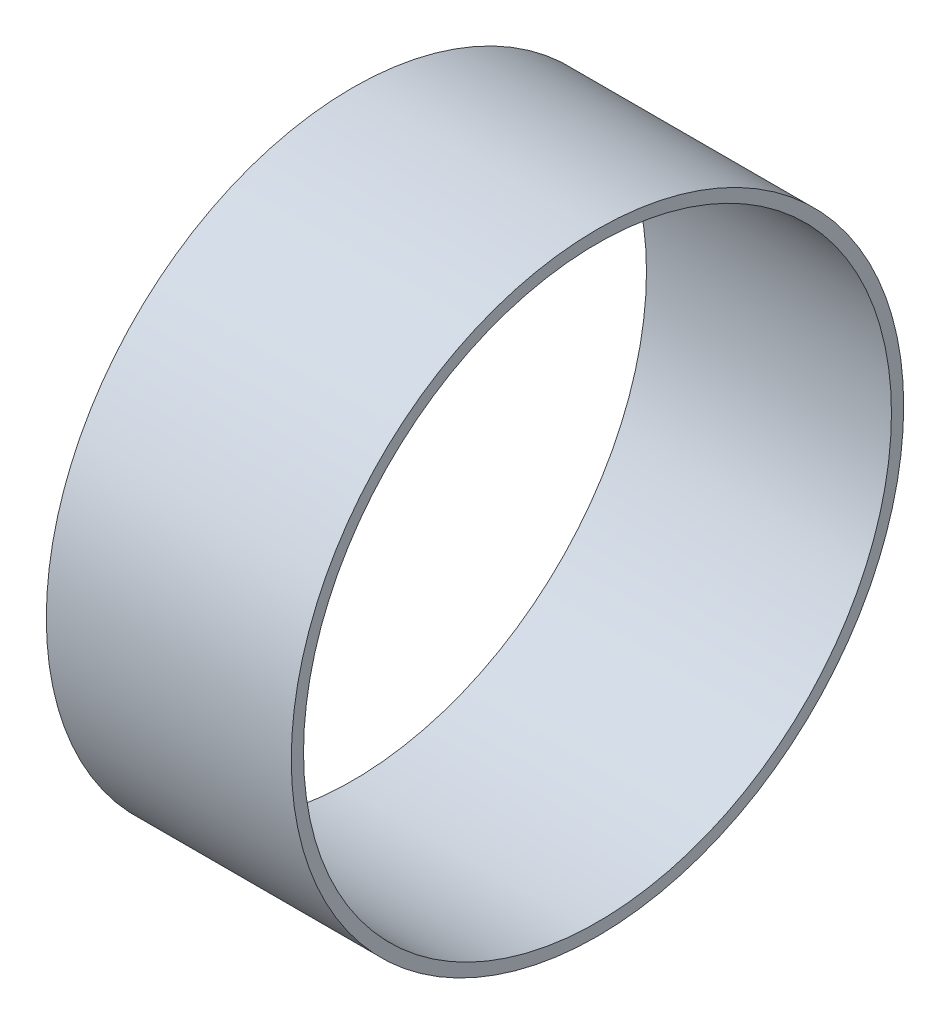
ISO-10303-21;
HEADER;
FILE_DESCRIPTION(('STEP AP214'),'2;1');
FILE_NAME('part.step','',(''),(''),'','','');
FILE_SCHEMA(('AUTOMOTIVE_DESIGN { 1 0 10303 214 1 1 1 1 }'));
ENDSEC;
DATA;
#1=APPLICATION_CONTEXT('core data for automotive mechanical design processes');
#2=APPLICATION_PROTOCOL_DEFINITION('international standard','automotive_design',2000,#1);
#3=PRODUCT_CONTEXT('',#1,'mechanical');
#4=PRODUCT('Part','Part','',(#3));
#5=PRODUCT_RELATED_PRODUCT_CATEGORY('part','',(#4));
#6=PRODUCT_DEFINITION_FORMATION('','',#4);
#7=PRODUCT_DEFINITION_CONTEXT('part definition',#1,'design');
#8=PRODUCT_DEFINITION('design','',#6,#7);
#9=PRODUCT_DEFINITION_SHAPE('','',#8);
#10=(LENGTH_UNIT() NAMED_UNIT(*) SI_UNIT(.MILLI.,.METRE.));
#11=(NAMED_UNIT(*) PLANE_ANGLE_UNIT() SI_UNIT($,.RADIAN.));
#12=(NAMED_UNIT(*) SI_UNIT($,.STERADIAN.) SOLID_ANGLE_UNIT());
#13=UNCERTAINTY_MEASURE_WITH_UNIT(LENGTH_MEASURE(1.E-05),#10,'distance_accuracy_value','');
#14=(GEOMETRIC_REPRESENTATION_CONTEXT(3) GLOBAL_UNCERTAINTY_ASSIGNED_CONTEXT((#13)) GLOBAL_UNIT_ASSIGNED_CONTEXT((#10,
#11,#12)) REPRESENTATION_CONTEXT('',''));
#15=CARTESIAN_POINT('',(0.,0.,0.));
#16=DIRECTION('',(0.,0.,1.));
#17=DIRECTION('',(1.,0.,0.));
#18=AXIS2_PLACEMENT_3D('',#15,#16,#17);
#19=CARTESIAN_POINT('',(10.,0.,0.));
#20=DIRECTION('',(1.,0.,0.));
#21=DIRECTION('',(0.,0.,-1.));
#22=AXIS2_PLACEMENT_3D('',#19,#20,#21);
#23=PLANE('',#22);
#24=CARTESIAN_POINT('',(10.,0.,0.));
#25=DIRECTION('',(1.,0.,0.));
#26=DIRECTION('',(0.,0.,-1.));
#27=AXIS2_PLACEMENT_3D('',#24,#25,#26);
#28=CIRCLE('',#27,12.5);
#29=CARTESIAN_POINT('',(10.,0.,-12.5));
#30=VERTEX_POINT('',#29);
#31=EDGE_CURVE('E10',#30,#30,#28,.T.);
#32=ORIENTED_EDGE('',*,*,#31,.T.);
#33=EDGE_LOOP('',(#32));
#34=FACE_BOUND('',#33,.T.);
#35=CARTESIAN_POINT('',(10.,0.,0.));
#36=DIRECTION('',(1.,0.,0.));
#37=DIRECTION('',(0.,0.,-1.));
#38=AXIS2_PLACEMENT_3D('',#35,#36,#37);
#39=CIRCLE('',#38,12.);
#40=CARTESIAN_POINT('',(10.,0.,-12.));
#41=VERTEX_POINT('',#40);
#42=EDGE_CURVE('E50',#41,#41,#39,.T.);
#43=ORIENTED_EDGE('',*,*,#42,.F.);
#44=EDGE_LOOP('',(#43));
#45=FACE_BOUND('',#44,.T.);
#46=ADVANCED_FACE('F37',(#34,#45),#23,.T.);
#47=CARTESIAN_POINT('',(0.,0.,0.));
#48=DIRECTION('',(1.,0.,0.));
#49=DIRECTION('',(0.,0.,-1.));
#50=AXIS2_PLACEMENT_3D('',#47,#48,#49);
#51=PLANE('',#50);
#52=CARTESIAN_POINT('',(0.,0.,0.));
#53=DIRECTION('',(1.,0.,0.));
#54=DIRECTION('',(0.,0.,-1.));
#55=AXIS2_PLACEMENT_3D('',#52,#53,#54);
#56=CIRCLE('',#55,12.5);
#57=CARTESIAN_POINT('',(0.,0.,-12.5));
#58=VERTEX_POINT('',#57);
#59=EDGE_CURVE('E41',#58,#58,#56,.T.);
#60=ORIENTED_EDGE('',*,*,#59,.F.);
#61=EDGE_LOOP('',(#60));
#62=FACE_BOUND('',#61,.T.);
#63=CARTESIAN_POINT('',(0.,0.,0.));
#64=DIRECTION('',(1.,0.,0.));
#65=DIRECTION('',(0.,0.,-1.));
#66=AXIS2_PLACEMENT_3D('',#63,#64,#65);
#67=CIRCLE('',#66,12.);
#68=CARTESIAN_POINT('',(0.,0.,-12.));
#69=VERTEX_POINT('',#68);
#70=EDGE_CURVE('E52',#69,#69,#67,.T.);
#71=ORIENTED_EDGE('',*,*,#70,.T.);
#72=EDGE_LOOP('',(#71));
#73=FACE_BOUND('',#72,.T.);
#74=ADVANCED_FACE('F64',(#62,#73),#51,.F.);
#75=CARTESIAN_POINT('',(10.,0.,0.));
#76=DIRECTION('',(-1.,0.,0.));
#77=DIRECTION('',(0.,0.,1.));
#78=AXIS2_PLACEMENT_3D('',#75,#76,#77);
#79=CYLINDRICAL_SURFACE('',#78,12.5);
#80=ORIENTED_EDGE('',*,*,#31,.F.);
#81=EDGE_LOOP('',(#80));
#82=FACE_BOUND('',#81,.T.);
#83=ORIENTED_EDGE('',*,*,#59,.T.);
#84=EDGE_LOOP('',(#83));
#85=FACE_BOUND('',#84,.T.);
#86=ADVANCED_FACE('F39',(#82,#85),#79,.T.);
#87=CARTESIAN_POINT('',(10.,0.,0.));
#88=DIRECTION('',(-1.,0.,0.));
#89=DIRECTION('',(0.,0.,1.));
#90=AXIS2_PLACEMENT_3D('',#87,#88,#89);
#91=CYLINDRICAL_SURFACE('',#90,12.);
#92=ORIENTED_EDGE('',*,*,#42,.T.);
#93=EDGE_LOOP('',(#92));
#94=FACE_BOUND('',#93,.T.);
#95=ORIENTED_EDGE('',*,*,#70,.F.);
#96=EDGE_LOOP('',(#95));
#97=FACE_BOUND('',#96,.T.);
#98=ADVANCED_FACE('F60',(#94,#97),#91,.F.);
#99=CLOSED_SHELL('',(#46,#74,#86,#98));
#100=MANIFOLD_SOLID_BREP('B2',#99);
#101=ADVANCED_BREP_SHAPE_REPRESENTATION('',(#18,#100),#14);
#102=SHAPE_DEFINITION_REPRESENTATION(#9,#101);
ENDSEC;
END-ISO-10303-21;
